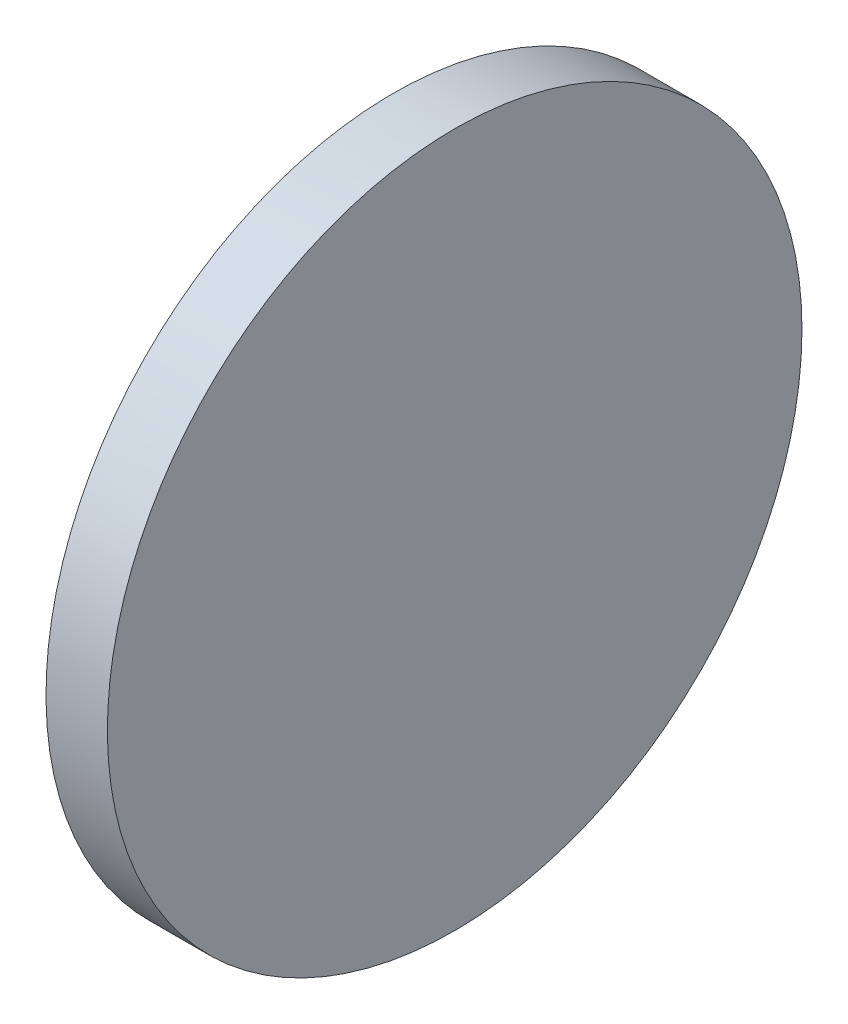
ISO-10303-21;
HEADER;
FILE_DESCRIPTION(('STEP AP214'),'2;1');
FILE_NAME('part.step','',(''),(''),'','','');
FILE_SCHEMA(('AUTOMOTIVE_DESIGN { 1 0 10303 214 1 1 1 1 }'));
ENDSEC;
DATA;
#1=APPLICATION_CONTEXT('core data for automotive mechanical design processes');
#2=APPLICATION_PROTOCOL_DEFINITION('international standard','automotive_design',2000,#1);
#3=PRODUCT_CONTEXT('',#1,'mechanical');
#4=PRODUCT('Part','Part','',(#3));
#5=PRODUCT_RELATED_PRODUCT_CATEGORY('part','',(#4));
#6=PRODUCT_DEFINITION_FORMATION('','',#4);
#7=PRODUCT_DEFINITION_CONTEXT('part definition',#1,'design');
#8=PRODUCT_DEFINITION('design','',#6,#7);
#9=PRODUCT_DEFINITION_SHAPE('','',#8);
#10=(LENGTH_UNIT() NAMED_UNIT(*) SI_UNIT(.MILLI.,.METRE.));
#11=(NAMED_UNIT(*) PLANE_ANGLE_UNIT() SI_UNIT($,.RADIAN.));
#12=(NAMED_UNIT(*) SI_UNIT($,.STERADIAN.) SOLID_ANGLE_UNIT());
#13=UNCERTAINTY_MEASURE_WITH_UNIT(LENGTH_MEASURE(1.E-05),#10,'distance_accuracy_value','');
#14=(GEOMETRIC_REPRESENTATION_CONTEXT(3) GLOBAL_UNCERTAINTY_ASSIGNED_CONTEXT((#13)) GLOBAL_UNIT_ASSIGNED_CONTEXT((#10,
#11,#12)) REPRESENTATION_CONTEXT('',''));
#15=CARTESIAN_POINT('',(0.,0.,0.));
#16=DIRECTION('',(0.,0.,1.));
#17=DIRECTION('',(1.,0.,0.));
#18=AXIS2_PLACEMENT_3D('',#15,#16,#17);
#19=CARTESIAN_POINT('',(-653.64346866019,1118.38048249989,17.725371062417));
#20=CARTESIAN_POINT('',(-653.64346866019,1119.12078788858,17.725371062417));
#21=CARTESIAN_POINT('',(-653.643468660191,1120.60139866597,17.8711984957075));
#22=CARTESIAN_POINT('',(-653.64346866019,1122.73696626929,18.5190158457942));
#23=CARTESIAN_POINT('',(-653.643468660191,1124.7051166445,19.5710141385682));
#24=CARTESIAN_POINT('',(-653.64346866019,1126.43021487642,20.9867656696057));
#25=CARTESIAN_POINT('',(-653.64346866019,1127.84596640746,22.7118639015312));
#26=CARTESIAN_POINT('',(-653.64346866019,1128.89796470023,24.6800142767386));
#27=CARTESIAN_POINT('',(-653.64346866019,1129.54578205032,26.8155818800596));
#28=CARTESIAN_POINT('',(-653.64346866019,1129.76452320026,29.036498046139));
#29=CARTESIAN_POINT('',(-653.64346866019,1129.54578205032,31.2574142122184));
#30=CARTESIAN_POINT('',(-653.64346866019,1128.89796470023,33.3929818155394));
#31=CARTESIAN_POINT('',(-653.643468660191,1127.84596640746,35.3611321907469));
#32=CARTESIAN_POINT('',(-653.64346866019,1126.43021487642,37.0862304226723));
#33=CARTESIAN_POINT('',(-653.64346866019,1124.7051166445,38.5019819537099));
#34=CARTESIAN_POINT('',(-653.64346866019,1122.73696626929,39.5539802464839));
#35=CARTESIAN_POINT('',(-653.64346866019,1120.60139866597,40.2017975965706));
#36=CARTESIAN_POINT('',(-653.64346866019,1118.38048249989,40.4205387465064));
#37=CARTESIAN_POINT('',(-653.64346866019,1116.15956633381,40.2017975965706));
#38=CARTESIAN_POINT('',(-653.64346866019,1114.02399873049,39.5539802464839));
#39=CARTESIAN_POINT('',(-653.64346866019,1112.05584835528,38.5019819537099));
#40=CARTESIAN_POINT('',(-653.64346866019,1110.33075012336,37.0862304226723));
#41=CARTESIAN_POINT('',(-653.64346866019,1108.91499859232,35.3611321907468));
#42=CARTESIAN_POINT('',(-653.64346866019,1107.86300029954,33.3929818155394));
#43=CARTESIAN_POINT('',(-653.64346866019,1107.21518294946,31.2574142122184));
#44=CARTESIAN_POINT('',(-653.64346866019,1106.99644179952,29.036498046139));
#45=CARTESIAN_POINT('',(-653.64346866019,1107.21518294946,26.8155818800596));
#46=CARTESIAN_POINT('',(-653.64346866019,1107.86300029954,24.6800142767386));
#47=CARTESIAN_POINT('',(-653.64346866019,1108.91499859232,22.7118639015312));
#48=CARTESIAN_POINT('',(-653.64346866019,1110.33075012336,20.9867656696057));
#49=CARTESIAN_POINT('',(-653.64346866019,1112.05584835528,19.5710141385682));
#50=CARTESIAN_POINT('',(-653.64346866019,1114.02399873049,18.5190158457942));
#51=CARTESIAN_POINT('',(-653.64346866019,1116.15956633381,17.8711984957075));
#52=CARTESIAN_POINT('',(-653.64346866019,1117.6401771112,17.725371062417));
#53=CARTESIAN_POINT('',(-653.64346866019,1118.38048249989,17.725371062417));
#54=B_SPLINE_CURVE_WITH_KNOTS('',3,(#19,#20,#21,#22,#23,#24,#25,#26,#27,#28,#29,#30,#31,#32,#33,
#34,#35,#36,#37,#38,#39,#40,#41,#42,#43,#44,#45,#46,#47,#48,#49,#50,#51,#52,#53),.UNSPECIFIED.,
.T.,.F.,(4,1,1,1,1,1,1,1,1,1,1,1,1,1,1,1,1,1,1,1,1,1,1,1,1,1,1,1,1,1,1,1,4),(0.,
0.0312499999999989,0.0625000000000009,0.0937500000000011,0.125,0.156250000000001,0.1875,0.21875,
0.25,0.28125,0.3125,0.343749999999999,0.375,0.406249999999999,0.437499999999999,
0.468750000000001,0.5,0.531249999999999,0.562500000000001,0.593750000000001,0.625,
0.656250000000001,0.6875,0.71875,0.75,0.78125,0.8125,0.843749999999999,0.875,0.906249999999999,
0.937499999999999,0.968750000000001,1.),.UNSPECIFIED.);
#55=DIRECTION('',(1.,0.,0.));
#56=VECTOR('',#55,1.);
#57=SURFACE_OF_LINEAR_EXTRUSION('',#54,#56);
#58=CARTESIAN_POINT('',(-653.64346866019,1118.38048249989,17.725371062417));
#59=CARTESIAN_POINT('',(-653.64346866019,1119.12078788858,17.725371062417));
#60=CARTESIAN_POINT('',(-653.643468660191,1120.60139866597,17.8711984957075));
#61=CARTESIAN_POINT('',(-653.64346866019,1122.73696626929,18.5190158457942));
#62=CARTESIAN_POINT('',(-653.643468660191,1124.7051166445,19.5710141385682));
#63=CARTESIAN_POINT('',(-653.64346866019,1126.43021487642,20.9867656696057));
#64=CARTESIAN_POINT('',(-653.64346866019,1127.84596640746,22.7118639015312));
#65=CARTESIAN_POINT('',(-653.64346866019,1128.89796470023,24.6800142767386));
#66=CARTESIAN_POINT('',(-653.64346866019,1129.54578205032,26.8155818800596));
#67=CARTESIAN_POINT('',(-653.64346866019,1129.76452320026,29.036498046139));
#68=CARTESIAN_POINT('',(-653.64346866019,1129.54578205032,31.2574142122184));
#69=CARTESIAN_POINT('',(-653.64346866019,1128.89796470023,33.3929818155394));
#70=CARTESIAN_POINT('',(-653.643468660191,1127.84596640746,35.3611321907469));
#71=CARTESIAN_POINT('',(-653.64346866019,1126.43021487642,37.0862304226723));
#72=CARTESIAN_POINT('',(-653.64346866019,1124.7051166445,38.5019819537099));
#73=CARTESIAN_POINT('',(-653.64346866019,1122.73696626929,39.5539802464839));
#74=CARTESIAN_POINT('',(-653.64346866019,1120.60139866597,40.2017975965706));
#75=CARTESIAN_POINT('',(-653.64346866019,1118.38048249989,40.4205387465064));
#76=CARTESIAN_POINT('',(-653.64346866019,1116.15956633381,40.2017975965706));
#77=CARTESIAN_POINT('',(-653.64346866019,1114.02399873049,39.5539802464839));
#78=CARTESIAN_POINT('',(-653.64346866019,1112.05584835528,38.5019819537099));
#79=CARTESIAN_POINT('',(-653.64346866019,1110.33075012336,37.0862304226723));
#80=CARTESIAN_POINT('',(-653.64346866019,1108.91499859232,35.3611321907468));
#81=CARTESIAN_POINT('',(-653.64346866019,1107.86300029954,33.3929818155394));
#82=CARTESIAN_POINT('',(-653.64346866019,1107.21518294946,31.2574142122184));
#83=CARTESIAN_POINT('',(-653.64346866019,1106.99644179952,29.036498046139));
#84=CARTESIAN_POINT('',(-653.64346866019,1107.21518294946,26.8155818800596));
#85=CARTESIAN_POINT('',(-653.64346866019,1107.86300029954,24.6800142767386));
#86=CARTESIAN_POINT('',(-653.64346866019,1108.91499859232,22.7118639015312));
#87=CARTESIAN_POINT('',(-653.64346866019,1110.33075012336,20.9867656696057));
#88=CARTESIAN_POINT('',(-653.64346866019,1112.05584835528,19.5710141385682));
#89=CARTESIAN_POINT('',(-653.64346866019,1114.02399873049,18.5190158457942));
#90=CARTESIAN_POINT('',(-653.64346866019,1116.15956633381,17.8711984957075));
#91=CARTESIAN_POINT('',(-653.64346866019,1117.6401771112,17.725371062417));
#92=CARTESIAN_POINT('',(-653.64346866019,1118.38048249989,17.725371062417));
#93=B_SPLINE_CURVE_WITH_KNOTS('',3,(#58,#59,#60,#61,#62,#63,#64,#65,#66,#67,#68,#69,#70,#71,#72,
#73,#74,#75,#76,#77,#78,#79,#80,#81,#82,#83,#84,#85,#86,#87,#88,#89,#90,#91,#92),.UNSPECIFIED.,
.T.,.F.,(4,1,1,1,1,1,1,1,1,1,1,1,1,1,1,1,1,1,1,1,1,1,1,1,1,1,1,1,1,1,1,1,4),(0.,
0.0312499999999989,0.0625000000000009,0.0937500000000011,0.125,0.156250000000001,0.1875,0.21875,
0.25,0.28125,0.3125,0.343749999999999,0.375,0.406249999999999,0.437499999999999,
0.468750000000001,0.5,0.531249999999999,0.562500000000001,0.593750000000001,0.625,
0.656250000000001,0.6875,0.71875,0.75,0.78125,0.8125,0.843749999999999,0.875,0.906249999999999,
0.937499999999999,0.968750000000001,1.),.UNSPECIFIED.);
#94=CARTESIAN_POINT('',(-653.64346866019,1118.38048249989,17.725371062417));
#95=VERTEX_POINT('',#94);
#96=EDGE_CURVE('E9',#95,#95,#93,.T.);
#97=ORIENTED_EDGE('',*,*,#96,.T.);
#98=EDGE_LOOP('',(#97));
#99=FACE_BOUND('',#98,.T.);
#100=CARTESIAN_POINT('',(-651.64346866019,1118.38048249989,17.725371062417));
#101=CARTESIAN_POINT('',(-651.64346866019,1118.19540501628,17.725371100806));
#102=CARTESIAN_POINT('',(-651.64346866019,1118.01032887964,17.7299282241305));
#103=CARTESIAN_POINT('',(-651.64346866019,1117.64062112494,17.7481128333038));
#104=CARTESIAN_POINT('',(-651.64346866019,1117.45598951035,17.7617403896099));
#105=CARTESIAN_POINT('',(-651.64346866019,1117.08761551347,17.7980220560369));
#106=CARTESIAN_POINT('',(-651.64346866019,1116.90387313118,17.8206761661576));
#107=CARTESIAN_POINT('',(-651.64346866019,1116.53772118322,17.8749674337174));
#108=CARTESIAN_POINT('',(-651.64346866019,1116.3553116072,17.9066045213762));
#109=CARTESIAN_POINT('',(-651.64346866019,1115.99227058133,17.9788178700891));
#110=CARTESIAN_POINT('',(-651.64346866019,1115.81163913148,18.019394131143));
#111=CARTESIAN_POINT('',(-651.64346866019,1115.45258244629,18.1093558344429));
#112=CARTESIAN_POINT('',(-651.64346866019,1115.27415722811,18.158741345115));
#113=CARTESIAN_POINT('',(-651.64346866019,1114.91993974414,18.2661920440049));
#114=CARTESIAN_POINT('',(-651.64346866019,1114.74414747837,18.3242572322225));
#115=CARTESIAN_POINT('',(-651.64346866019,1114.39562270938,18.4489380170124));
#116=CARTESIAN_POINT('',(-651.64346866019,1114.22289018242,18.515553547163));
#117=CARTESIAN_POINT('',(-651.64346866019,1113.88091302126,18.657205125321));
#118=CARTESIAN_POINT('',(-651.64346866019,1113.71166838707,18.7322411733284));
#119=CARTESIAN_POINT('',(-651.64346866019,1113.377061531,18.8905227725828));
#120=CARTESIAN_POINT('',(-651.64346866019,1113.21169933929,18.9737683875958));
#121=CARTESIAN_POINT('',(-651.64346866019,1112.88525063696,19.1482588543061));
#122=CARTESIAN_POINT('',(-651.64346866019,1112.72416412634,19.2395037060034));
#123=CARTESIAN_POINT('',(-651.64346866019,1112.40666017737,19.4297825939236));
#124=CARTESIAN_POINT('',(-651.64346866019,1112.25024270276,19.528816569636));
#125=CARTESIAN_POINT('',(-651.64346866019,1111.9424713889,19.7344627869215));
#126=CARTESIAN_POINT('',(-651.64346866019,1111.79111754965,19.8410750284946));
#127=CARTESIAN_POINT('',(-651.64346866019,1111.49381927865,20.0615938505046));
#128=CARTESIAN_POINT('',(-651.64346866019,1111.34787488893,20.1755004875966));
#129=CARTESIAN_POINT('',(-651.64346866019,1111.06174020822,20.4103251513752));
#130=CARTESIAN_POINT('',(-651.64346866019,1110.92154991723,20.5312431780618));
#131=CARTESIAN_POINT('',(-651.64346866019,1110.64726828713,20.7798078581517));
#132=CARTESIAN_POINT('',(-651.64346866019,1110.51317690064,20.9074544592808));
#133=CARTESIAN_POINT('',(-651.64346866019,1110.25143891303,21.1691924468932));
#134=CARTESIAN_POINT('',(-651.64346866019,1110.1237923119,21.3032838333765));
#135=CARTESIAN_POINT('',(-651.64346866019,1109.87522763181,21.57756546348));
#136=CARTESIAN_POINT('',(-651.64346866019,1109.75430960513,21.7177557544674));
#137=CARTESIAN_POINT('',(-651.64346866019,1109.51948494135,22.0038904351766));
#138=CARTESIAN_POINT('',(-651.64346866019,1109.40557830425,22.1498348248984));
#139=CARTESIAN_POINT('',(-651.64346866019,1109.18505948224,22.4471330958987));
#140=CARTESIAN_POINT('',(-651.64346866019,1109.07844724067,22.5984869351484));
#141=CARTESIAN_POINT('',(-651.64346866019,1108.87280102339,22.9062582490082));
#142=CARTESIAN_POINT('',(-651.64346866019,1108.77376704767,23.0626757236183));
#143=CARTESIAN_POINT('',(-651.64346866019,1108.58348815975,23.3801796725894));
#144=CARTESIAN_POINT('',(-651.64346866019,1108.49224330806,23.5412661832091));
#145=CARTESIAN_POINT('',(-651.64346866019,1108.31775284135,23.8677148855355));
#146=CARTESIAN_POINT('',(-651.64346866019,1108.23450722633,24.0330770772422));
#147=CARTESIAN_POINT('',(-651.64346866019,1108.07622562708,24.3676839333252));
#148=CARTESIAN_POINT('',(-651.64346866019,1108.00118957907,24.5369285675331));
#149=CARTESIAN_POINT('',(-651.64346866019,1107.85953800091,24.8789057286488));
#150=CARTESIAN_POINT('',(-651.64346866019,1107.79292247077,25.0516382555565));
#151=CARTESIAN_POINT('',(-651.64346866019,1107.66824168597,25.4001630246945));
#152=CARTESIAN_POINT('',(-651.64346866019,1107.61017649774,25.5759552906818));
#153=CARTESIAN_POINT('',(-651.64346866019,1107.50272579888,25.9301727740695));
#154=CARTESIAN_POINT('',(-651.64346866019,1107.45334028825,26.1085979914699));
#155=CARTESIAN_POINT('',(-651.64346866019,1107.36337858484,26.4676546788059));
#156=CARTESIAN_POINT('',(-651.64346866019,1107.32280232364,26.6482861315929));
#157=CARTESIAN_POINT('',(-651.64346866019,1107.25058897532,27.0113271494458));
#158=CARTESIAN_POINT('',(-651.64346866019,1107.21895188821,27.1937367145116));
#159=CARTESIAN_POINT('',(-651.64346866019,1107.16466061917,27.5598886923935));
#160=CARTESIAN_POINT('',(-651.64346866019,1107.14200650703,27.7436311155519));
#161=CARTESIAN_POINT('',(-651.64346866019,1107.10572484612,28.1120050007617));
#162=CARTESIAN_POINT('',(-651.64346866019,1107.09209729734,28.2966364628132));
#163=CARTESIAN_POINT('',(-651.64346866019,1107.07391266759,28.6663446342693));
#164=CARTESIAN_POINT('',(-651.64346866019,1107.06935551617,28.8514213402042));
#165=CARTESIAN_POINT('',(-651.64346866019,1107.06935551617,29.2215747520739));
#166=CARTESIAN_POINT('',(-651.64346866019,1107.07391266759,29.4066514580088));
#167=CARTESIAN_POINT('',(-651.64346866019,1107.09209729734,29.7763596294649));
#168=CARTESIAN_POINT('',(-651.64346866019,1107.10572484612,29.9609910915163));
#169=CARTESIAN_POINT('',(-651.64346866019,1107.14200650703,30.3293649767262));
#170=CARTESIAN_POINT('',(-651.64346866019,1107.16466061917,30.5131073998846));
#171=CARTESIAN_POINT('',(-651.64346866019,1107.21895188821,30.8792593777664));
#172=CARTESIAN_POINT('',(-651.64346866019,1107.25058897532,31.0616689428322));
#173=CARTESIAN_POINT('',(-651.64346866019,1107.32280232364,31.4247099606851));
#174=CARTESIAN_POINT('',(-651.64346866019,1107.36337858484,31.6053414134722));
#175=CARTESIAN_POINT('',(-651.64346866019,1107.45334028825,31.9643981008082));
#176=CARTESIAN_POINT('',(-651.64346866019,1107.50272579888,32.1428233182086));
#177=CARTESIAN_POINT('',(-651.64346866019,1107.61017649774,32.4970408015963));
#178=CARTESIAN_POINT('',(-651.64346866019,1107.66824168597,32.6728330675836));
#179=CARTESIAN_POINT('',(-651.64346866019,1107.79292247077,33.0213578367215));
#180=CARTESIAN_POINT('',(-651.64346866019,1107.85953800091,33.1940903636293));
#181=CARTESIAN_POINT('',(-651.64346866019,1108.00118957907,33.536067524745));
#182=CARTESIAN_POINT('',(-651.64346866019,1108.07622562708,33.7053121589529));
#183=CARTESIAN_POINT('',(-651.64346866019,1108.23450722633,34.0399190150359));
#184=CARTESIAN_POINT('',(-651.64346866019,1108.31775284135,34.2052812067425));
#185=CARTESIAN_POINT('',(-651.64346866019,1108.49224330806,34.5317299090689));
#186=CARTESIAN_POINT('',(-651.64346866019,1108.58348815975,34.6928164196887));
#187=CARTESIAN_POINT('',(-651.64346866019,1108.77376704767,35.0103203686598));
#188=CARTESIAN_POINT('',(-651.64346866019,1108.87280102339,35.1667378432699));
#189=CARTESIAN_POINT('',(-651.64346866019,1109.07844724067,35.4745091571298));
#190=CARTESIAN_POINT('',(-651.64346866019,1109.18505948225,35.6258629963794));
#191=CARTESIAN_POINT('',(-651.64346866019,1109.40557830426,35.9231612673796));
#192=CARTESIAN_POINT('',(-651.64346866019,1109.51948494135,36.0691056571014));
#193=CARTESIAN_POINT('',(-651.64346866019,1109.75430960513,36.3552403378107));
#194=CARTESIAN_POINT('',(-651.64346866019,1109.87522763181,36.4954306287981));
#195=CARTESIAN_POINT('',(-651.64346866019,1110.1237923119,36.7697122589016));
#196=CARTESIAN_POINT('',(-651.64346866019,1110.25143891303,36.9038036453848));
#197=CARTESIAN_POINT('',(-651.64346866019,1110.51317690064,37.1655416329973));
#198=CARTESIAN_POINT('',(-651.64346866019,1110.64726828713,37.2931882341265));
#199=CARTESIAN_POINT('',(-651.64346866019,1110.92154991723,37.5417529142163));
#200=CARTESIAN_POINT('',(-651.64346866019,1111.06174020822,37.6626709409028));
#201=CARTESIAN_POINT('',(-651.64346866019,1111.34787488893,37.8974956046814));
#202=CARTESIAN_POINT('',(-651.64346866019,1111.49381927865,38.0114022417736));
#203=CARTESIAN_POINT('',(-651.64346866019,1111.79111754965,38.2319210637836));
#204=CARTESIAN_POINT('',(-651.64346866019,1111.9424713889,38.3385333053566));
#205=CARTESIAN_POINT('',(-651.64346866019,1112.25024270276,38.5441795226421));
#206=CARTESIAN_POINT('',(-651.64346866019,1112.40666017737,38.6432134983545));
#207=CARTESIAN_POINT('',(-651.64346866019,1112.72416412634,38.8334923862747));
#208=CARTESIAN_POINT('',(-651.64346866019,1112.88525063696,38.924737237972));
#209=CARTESIAN_POINT('',(-651.64346866019,1113.21169933929,39.0992277046822));
#210=CARTESIAN_POINT('',(-651.64346866019,1113.37706153099,39.182473319695));
#211=CARTESIAN_POINT('',(-651.64346866019,1113.71166838708,39.34075491895));
#212=CARTESIAN_POINT('',(-651.64346866019,1113.88091302128,39.415790966958));
#213=CARTESIAN_POINT('',(-651.64346866019,1114.2228901824,39.557442545114));
#214=CARTESIAN_POINT('',(-651.643468660191,1114.39562270931,39.6240580752619));
#215=CARTESIAN_POINT('',(-651.643468660191,1114.74414747845,39.7487388600594));
#216=CARTESIAN_POINT('',(-651.643468660191,1114.91993974443,39.8068040482874));
#217=CARTESIAN_POINT('',(-651.643468660191,1115.27415722782,39.9142547471488));
#218=CARTESIAN_POINT('',(-651.64346866019,1115.45258244522,39.9636402577821));
#219=CARTESIAN_POINT('',(-651.64346866019,1115.81163913256,40.0536019611881));
#220=CARTESIAN_POINT('',(-651.64346866019,1115.99227058534,40.0941782223869));
#221=CARTESIAN_POINT('',(-651.64346866019,1116.3553116032,40.166391570704));
#222=CARTESIAN_POINT('',(-651.64346866019,1116.53772116826,40.1980286578221));
#223=CARTESIAN_POINT('',(-651.64346866019,1116.90387314614,40.2523199268589));
#224=CARTESIAN_POINT('',(-651.64346866019,1117.0876155693,40.2749740389974));
#225=CARTESIAN_POINT('',(-651.64346866019,1117.45598945451,40.3112556999119));
#226=CARTESIAN_POINT('',(-651.64346866019,1117.64062091656,40.3248832486879));
#227=CARTESIAN_POINT('',(-651.64346866019,1118.01032908802,40.343067878434));
#228=CARTESIAN_POINT('',(-651.64346866019,1118.19540579395,40.3476250298611));
#229=CARTESIAN_POINT('',(-651.64346866019,1118.56555920582,40.3476250298611));
#230=CARTESIAN_POINT('',(-651.64346866019,1118.75063591176,40.343067878434));
#231=CARTESIAN_POINT('',(-651.64346866019,1119.12034408322,40.3248832486879));
#232=CARTESIAN_POINT('',(-651.64346866019,1119.30497554527,40.3112556999119));
#233=CARTESIAN_POINT('',(-651.64346866019,1119.67334943048,40.2749740389975));
#234=CARTESIAN_POINT('',(-651.64346866019,1119.85709185363,40.252319926859));
#235=CARTESIAN_POINT('',(-651.64346866019,1120.22324383152,40.1980286578221));
#236=CARTESIAN_POINT('',(-651.64346866019,1120.40565339658,40.1663915707039));
#237=CARTESIAN_POINT('',(-651.64346866019,1120.76869441444,40.0941782223869));
#238=CARTESIAN_POINT('',(-651.64346866019,1120.94932586722,40.0536019611881));
#239=CARTESIAN_POINT('',(-651.64346866019,1121.30838255456,39.9636402577822));
#240=CARTESIAN_POINT('',(-651.64346866019,1121.48680777196,39.9142547471488));
#241=CARTESIAN_POINT('',(-651.64346866019,1121.84102525535,39.8068040482874));
#242=CARTESIAN_POINT('',(-651.64346866019,1122.01681752133,39.7487388600594));
#243=CARTESIAN_POINT('',(-651.64346866019,1122.36534229047,39.6240580752619));
#244=CARTESIAN_POINT('',(-651.64346866019,1122.53807481738,39.557442545114));
#245=CARTESIAN_POINT('',(-651.64346866019,1122.8800519785,39.415790966958));
#246=CARTESIAN_POINT('',(-651.64346866019,1123.0492966127,39.3407549189499));
#247=CARTESIAN_POINT('',(-651.64346866019,1123.38390346879,39.182473319695));
#248=CARTESIAN_POINT('',(-651.64346866019,1123.54926566049,39.0992277046822));
#249=CARTESIAN_POINT('',(-651.64346866019,1123.87571436282,38.9247372379721));
#250=CARTESIAN_POINT('',(-651.64346866019,1124.03680087344,38.8334923862748));
#251=CARTESIAN_POINT('',(-651.64346866019,1124.35430482241,38.6432134983545));
#252=CARTESIAN_POINT('',(-651.64346866019,1124.51072229702,38.5441795226421));
#253=CARTESIAN_POINT('',(-651.64346866019,1124.81849361088,38.3385333053566));
#254=CARTESIAN_POINT('',(-651.64346866019,1124.96984745013,38.2319210637835));
#255=CARTESIAN_POINT('',(-651.64346866019,1125.26714572113,38.0114022417736));
#256=CARTESIAN_POINT('',(-651.64346866019,1125.41309011085,37.8974956046815));
#257=CARTESIAN_POINT('',(-651.64346866019,1125.69922479156,37.6626709409029));
#258=CARTESIAN_POINT('',(-651.64346866019,1125.83941508255,37.5417529142163));
#259=CARTESIAN_POINT('',(-651.64346866019,1126.11369671265,37.2931882341265));
#260=CARTESIAN_POINT('',(-651.64346866019,1126.24778809914,37.1655416329973));
#261=CARTESIAN_POINT('',(-651.64346866019,1126.50952608675,36.9038036453848));
#262=CARTESIAN_POINT('',(-651.64346866019,1126.63717268788,36.7697122589015));
#263=CARTESIAN_POINT('',(-651.64346866019,1126.88573736797,36.4954306287981));
#264=CARTESIAN_POINT('',(-651.64346866019,1127.00665539465,36.3552403378107));
#265=CARTESIAN_POINT('',(-651.64346866019,1127.24148005843,36.0691056571015));
#266=CARTESIAN_POINT('',(-651.643468660191,1127.35538669552,35.9231612673796));
#267=CARTESIAN_POINT('',(-651.643468660191,1127.57590551753,35.6258629963793));
#268=CARTESIAN_POINT('',(-651.64346866019,1127.68251775911,35.4745091571298));
#269=CARTESIAN_POINT('',(-651.64346866019,1127.88816397639,35.16673784327));
#270=CARTESIAN_POINT('',(-651.64346866019,1127.98719795211,35.0103203686598));
#271=CARTESIAN_POINT('',(-651.64346866019,1128.17747684003,34.6928164196887));
#272=CARTESIAN_POINT('',(-651.64346866019,1128.26872169172,34.531729909069));
#273=CARTESIAN_POINT('',(-651.64346866019,1128.44321215843,34.2052812067425));
#274=CARTESIAN_POINT('',(-651.64346866019,1128.52645777345,34.0399190150358));
#275=CARTESIAN_POINT('',(-651.64346866019,1128.6847393727,33.7053121589529));
#276=CARTESIAN_POINT('',(-651.64346866019,1128.75977542071,33.536067524745));
#277=CARTESIAN_POINT('',(-651.64346866019,1128.90142699886,33.1940903636293));
#278=CARTESIAN_POINT('',(-651.64346866019,1128.96804252901,33.0213578367215));
#279=CARTESIAN_POINT('',(-651.64346866019,1129.09272331381,32.6728330675836));
#280=CARTESIAN_POINT('',(-651.64346866019,1129.15078850204,32.4970408015963));
#281=CARTESIAN_POINT('',(-651.64346866019,1129.2582392009,32.1428233182086));
#282=CARTESIAN_POINT('',(-651.64346866019,1129.30762471153,31.9643981008082));
#283=CARTESIAN_POINT('',(-651.64346866019,1129.39758641494,31.6053414134722));
#284=CARTESIAN_POINT('',(-651.64346866019,1129.43816267614,31.4247099606851));
#285=CARTESIAN_POINT('',(-651.64346866019,1129.51037602445,31.0616689428322));
#286=CARTESIAN_POINT('',(-651.64346866019,1129.54201311157,30.8792593777664));
#287=CARTESIAN_POINT('',(-651.64346866019,1129.59630438061,30.5131073998846));
#288=CARTESIAN_POINT('',(-651.64346866019,1129.61895849275,30.3293649767262));
#289=CARTESIAN_POINT('',(-651.64346866019,1129.65524015366,29.9609910915163));
#290=CARTESIAN_POINT('',(-651.64346866019,1129.66886770244,29.7763596294649));
#291=CARTESIAN_POINT('',(-651.64346866019,1129.68705233218,29.4066514580088));
#292=CARTESIAN_POINT('',(-651.64346866019,1129.69160948361,29.2215747520739));
#293=CARTESIAN_POINT('',(-651.64346866019,1129.69160948361,28.8514213402042));
#294=CARTESIAN_POINT('',(-651.64346866019,1129.68705233218,28.6663446342693));
#295=CARTESIAN_POINT('',(-651.64346866019,1129.66886770244,28.2966364628132));
#296=CARTESIAN_POINT('',(-651.64346866019,1129.65524015366,28.1120050007617));
#297=CARTESIAN_POINT('',(-651.64346866019,1129.61895849275,27.7436311155519));
#298=CARTESIAN_POINT('',(-651.64346866019,1129.59630438061,27.5598886923935));
#299=CARTESIAN_POINT('',(-651.64346866019,1129.54201311157,27.1937367145117));
#300=CARTESIAN_POINT('',(-651.64346866019,1129.51037602445,27.0113271494458));
#301=CARTESIAN_POINT('',(-651.64346866019,1129.43816267614,26.6482861315929));
#302=CARTESIAN_POINT('',(-651.64346866019,1129.39758641494,26.4676546788059));
#303=CARTESIAN_POINT('',(-651.64346866019,1129.30762471153,26.1085979914699));
#304=CARTESIAN_POINT('',(-651.64346866019,1129.2582392009,25.9301727740695));
#305=CARTESIAN_POINT('',(-651.64346866019,1129.15078850204,25.5759552906818));
#306=CARTESIAN_POINT('',(-651.64346866019,1129.09272331381,25.4001630246945));
#307=CARTESIAN_POINT('',(-651.64346866019,1128.96804252901,25.0516382555565));
#308=CARTESIAN_POINT('',(-651.64346866019,1128.90142699886,24.8789057286487));
#309=CARTESIAN_POINT('',(-651.64346866019,1128.75977542071,24.536928567533));
#310=CARTESIAN_POINT('',(-651.64346866019,1128.6847393727,24.3676839333252));
#311=CARTESIAN_POINT('',(-651.64346866019,1128.52645777345,24.0330770772423));
#312=CARTESIAN_POINT('',(-651.64346866019,1128.44321215843,23.8677148855355));
#313=CARTESIAN_POINT('',(-651.64346866019,1128.26872169172,23.5412661832091));
#314=CARTESIAN_POINT('',(-651.64346866019,1128.17747684003,23.3801796725894));
#315=CARTESIAN_POINT('',(-651.64346866019,1127.9871979521,23.0626757236183));
#316=CARTESIAN_POINT('',(-651.64346866019,1127.88816397639,22.9062582490081));
#317=CARTESIAN_POINT('',(-651.64346866019,1127.68251775911,22.5984869351483));
#318=CARTESIAN_POINT('',(-651.64346866019,1127.57590551753,22.4471330958987));
#319=CARTESIAN_POINT('',(-651.64346866019,1127.35538669552,22.1498348248985));
#320=CARTESIAN_POINT('',(-651.64346866019,1127.24148005843,22.0038904351766));
#321=CARTESIAN_POINT('',(-651.64346866019,1127.00665539465,21.7177557544674));
#322=CARTESIAN_POINT('',(-651.64346866019,1126.88573736797,21.57756546348));
#323=CARTESIAN_POINT('',(-651.64346866019,1126.63717268788,21.3032838333765));
#324=CARTESIAN_POINT('',(-651.64346866019,1126.50952608675,21.1691924468933));
#325=CARTESIAN_POINT('',(-651.64346866019,1126.24778809914,20.9074544592808));
#326=CARTESIAN_POINT('',(-651.64346866019,1126.11369671265,20.7798078581516));
#327=CARTESIAN_POINT('',(-651.64346866019,1125.83941508255,20.5312431780618));
#328=CARTESIAN_POINT('',(-651.64346866019,1125.69922479156,20.4103251513752));
#329=CARTESIAN_POINT('',(-651.64346866019,1125.41309011085,20.1755004875966));
#330=CARTESIAN_POINT('',(-651.64346866019,1125.26714572113,20.0615938505045));
#331=CARTESIAN_POINT('',(-651.64346866019,1124.96984745013,19.8410750284945));
#332=CARTESIAN_POINT('',(-651.64346866019,1124.81849361088,19.7344627869215));
#333=CARTESIAN_POINT('',(-651.64346866019,1124.51072229702,19.528816569636));
#334=CARTESIAN_POINT('',(-651.64346866019,1124.35430482241,19.4297825939236));
#335=CARTESIAN_POINT('',(-651.64346866019,1124.03680087344,19.2395037060034));
#336=CARTESIAN_POINT('',(-651.64346866019,1123.87571436282,19.1482588543061));
#337=CARTESIAN_POINT('',(-651.64346866019,1123.54926566049,18.9737683875958));
#338=CARTESIAN_POINT('',(-651.64346866019,1123.38390346878,18.8905227725828));
#339=CARTESIAN_POINT('',(-651.64346866019,1123.04929661271,18.7322411733284));
#340=CARTESIAN_POINT('',(-651.64346866019,1122.88005197852,18.6572051253211));
#341=CARTESIAN_POINT('',(-651.64346866019,1122.53807481736,18.5155535471631));
#342=CARTESIAN_POINT('',(-651.64346866019,1122.36534229039,18.4489380170124));
#343=CARTESIAN_POINT('',(-651.64346866019,1122.01681752141,18.3242572322225));
#344=CARTESIAN_POINT('',(-651.64346866019,1121.84102525563,18.2661920440049));
#345=CARTESIAN_POINT('',(-651.64346866019,1121.48680777167,18.1587413451151));
#346=CARTESIAN_POINT('',(-651.64346866019,1121.30838255348,18.1093558344429));
#347=CARTESIAN_POINT('',(-651.64346866019,1120.9493258683,18.019394131143));
#348=CARTESIAN_POINT('',(-651.64346866019,1120.76869441844,17.978817870089));
#349=CARTESIAN_POINT('',(-651.64346866019,1120.40565339257,17.9066045213763));
#350=CARTESIAN_POINT('',(-651.64346866019,1120.22324381656,17.8749674337174));
#351=CARTESIAN_POINT('',(-651.64346866019,1119.8570918686,17.8206761661576));
#352=CARTESIAN_POINT('',(-651.64346866019,1119.67334948631,17.7980220560369));
#353=CARTESIAN_POINT('',(-651.64346866019,1119.30497548943,17.7617403896099));
#354=CARTESIAN_POINT('',(-651.64346866019,1119.12034387484,17.7481128333038));
#355=CARTESIAN_POINT('',(-651.64346866019,1118.75063612014,17.7299282241305));
#356=CARTESIAN_POINT('',(-651.64346866019,1118.5655599835,17.725371100806));
#357=CARTESIAN_POINT('',(-651.64346866019,1118.38048249989,17.725371062417));
#358=B_SPLINE_CURVE_WITH_KNOTS('',3,(#100,#101,#102,#103,#104,#105,#106,#107,#108,#109,#110,
#111,#112,#113,#114,#115,#116,#117,#118,#119,#120,#121,#122,#123,#124,#125,#126,#127,#128,#129,
#130,#131,#132,#133,#134,#135,#136,#137,#138,#139,#140,#141,#142,#143,#144,#145,#146,#147,#148,
#149,#150,#151,#152,#153,#154,#155,#156,#157,#158,#159,#160,#161,#162,#163,#164,#165,#166,#167,
#168,#169,#170,#171,#172,#173,#174,#175,#176,#177,#178,#179,#180,#181,#182,#183,#184,#185,#186,
#187,#188,#189,#190,#191,#192,#193,#194,#195,#196,#197,#198,#199,#200,#201,#202,#203,#204,#205,
#206,#207,#208,#209,#210,#211,#212,#213,#214,#215,#216,#217,#218,#219,#220,#221,#222,#223,#224,
#225,#226,#227,#228,#229,#230,#231,#232,#233,#234,#235,#236,#237,#238,#239,#240,#241,#242,#243,
#244,#245,#246,#247,#248,#249,#250,#251,#252,#253,#254,#255,#256,#257,#258,#259,#260,#261,#262,
#263,#264,#265,#266,#267,#268,#269,#270,#271,#272,#273,#274,#275,#276,#277,#278,#279,#280,#281,
#282,#283,#284,#285,#286,#287,#288,#289,#290,#291,#292,#293,#294,#295,#296,#297,#298,#299,#300,
#301,#302,#303,#304,#305,#306,#307,#308,#309,#310,#311,#312,#313,#314,#315,#316,#317,#318,#319,
#320,#321,#322,#323,#324,#325,#326,#327,#328,#329,#330,#331,#332,#333,#334,#335,#336,#337,#338,
#339,#340,#341,#342,#343,#344,#345,#346,#347,#348,#349,#350,#351,#352,#353,#354,#355,#356,#357),
.UNSPECIFIED.,.F.,.F.,(4,2,2,2,2,2,2,2,2,2,2,2,2,2,2,2,2,2,2,2,2,2,2,2,2,2,2,2,2,2,2,2,2,2,2,2,
2,2,2,2,2,2,2,2,2,2,2,2,2,2,2,2,2,2,2,2,2,2,2,2,2,2,2,2,2,2,2,2,2,2,2,2,2,2,2,2,2,2,2,2,2,2,2,2,
2,2,2,2,2,2,2,2,2,2,2,2,2,2,2,2,2,2,2,2,2,2,2,2,2,2,2,2,2,2,2,2,2,2,2,2,2,2,2,2,2,2,2,2,4),(0.,
0.555174596330017,1.11035350519378,1.66553241405784,2.22070701038764,2.77588160671747,
3.33106051558157,3.88623942444514,4.44141402077506,4.9965886171048,5.55176752596891,
6.10694643483263,6.66212103116257,7.21729562749227,7.77247453635642,8.32765344522019,
8.88282804155016,9.43800263788,9.9931815467439,10.5483604556079,11.1035350519374,
11.6587096482674,12.2138885571314,12.7690674659952,13.324242062325,13.8794166586549,
14.4345955675188,14.9897744763826,15.5449490727125,16.1001236690424,16.6553025779062,
17.2104814867702,17.7656560831,18.3208306794299,18.8760095882938,19.4311884971577,
19.9863630934875,20.5415376898174,21.0967165986813,21.6518955075452,22.2070701038751,
22.7622447002049,23.3174236090689,23.8726025179328,24.4277771142626,24.9829517105925,
25.5381306194564,26.0933095283202,26.64848412465,27.2036587209798,27.7588376298439,
28.3140165387076,28.8691911350376,29.4243657313676,29.9795446402315,30.5347235490952,
31.0898981454251,31.6450727417548,32.2002516506188,32.7554305594827,33.3106051558123,
33.8657797521426,34.4209586610062,34.9761375698702,35.5313121662,36.0864867625298,
36.6416656713938,37.1968445802576,37.7520191765874,38.3071937729174,38.8623726817811,
39.4175515906451,39.972726186975,40.5279007833048,41.0830796921689,41.6382586010328,
42.1934331973625,42.7486077936924,43.3037867025564,43.8589656114203,44.4141402077501,
44.9693148040798,45.5244937129439,46.0796726218077,46.6348472181376,47.1900218144675,
47.7452007233314,48.3003796321952,48.8555542285249,49.4107288248549,49.9659077337188,
50.5210866425828,51.0762612389125,51.6314358352424,52.1866147441063,52.7417936529702,
53.2969682493001,53.8521428456299,54.4073217544938,54.9625006633578,55.5176752596876,
56.0728498560174,56.6280287648813,57.1832076737452,57.738382270075,58.2935568664049,
58.8487357752687,59.4039146841327,59.9590892804626,60.5142638767924,61.0694427856564,
61.6246216945204,62.1797962908501,62.7349708871799,63.2901497960438,63.8453287049076,
64.4005033012375,64.9556778975675,65.5108568064312,66.0660357152953,66.6212103116252,
67.1763849079552,67.7315638168189,68.2867427256826,68.8419173220126,69.3970919183425,
69.9522708272063,70.5074497360701,71.0626243324001),.UNSPECIFIED.);
#359=CARTESIAN_POINT('',(-651.64346866019,1118.38048249989,17.725371062417));
#360=VERTEX_POINT('',#359);
#361=EDGE_CURVE('E24',#360,#360,#358,.F.);
#362=ORIENTED_EDGE('',*,*,#361,.F.);
#363=EDGE_LOOP('',(#362));
#364=FACE_BOUND('',#363,.T.);
#365=ADVANCED_FACE('F14',(#99,#364),#57,.T.);
#366=CARTESIAN_POINT('',(-653.64346866019,1129.38048249989,29.036498046139));
#367=DIRECTION('',(1.,0.,0.));
#368=DIRECTION('',(0.,1.,0.));
#369=AXIS2_PLACEMENT_3D('',#366,#367,#368);
#370=PLANE('',#369);
#371=ORIENTED_EDGE('',*,*,#96,.F.);
#372=EDGE_LOOP('',(#371));
#373=FACE_BOUND('',#372,.T.);
#374=ADVANCED_FACE('F62',(#373),#370,.F.);
#375=CARTESIAN_POINT('',(-651.64346866019,1129.38048249989,29.036498046139));
#376=DIRECTION('',(1.,0.,0.));
#377=DIRECTION('',(0.,1.,0.));
#378=AXIS2_PLACEMENT_3D('',#375,#376,#377);
#379=PLANE('',#378);
#380=ORIENTED_EDGE('',*,*,#361,.T.);
#381=EDGE_LOOP('',(#380));
#382=FACE_BOUND('',#381,.T.);
#383=ADVANCED_FACE('F31',(#382),#379,.T.);
#384=CLOSED_SHELL('',(#365,#374,#383));
#385=MANIFOLD_SOLID_BREP('B1',#384);
#386=ADVANCED_BREP_SHAPE_REPRESENTATION('',(#18,#385),#14);
#387=SHAPE_DEFINITION_REPRESENTATION(#9,#386);
ENDSEC;
END-ISO-10303-21;
